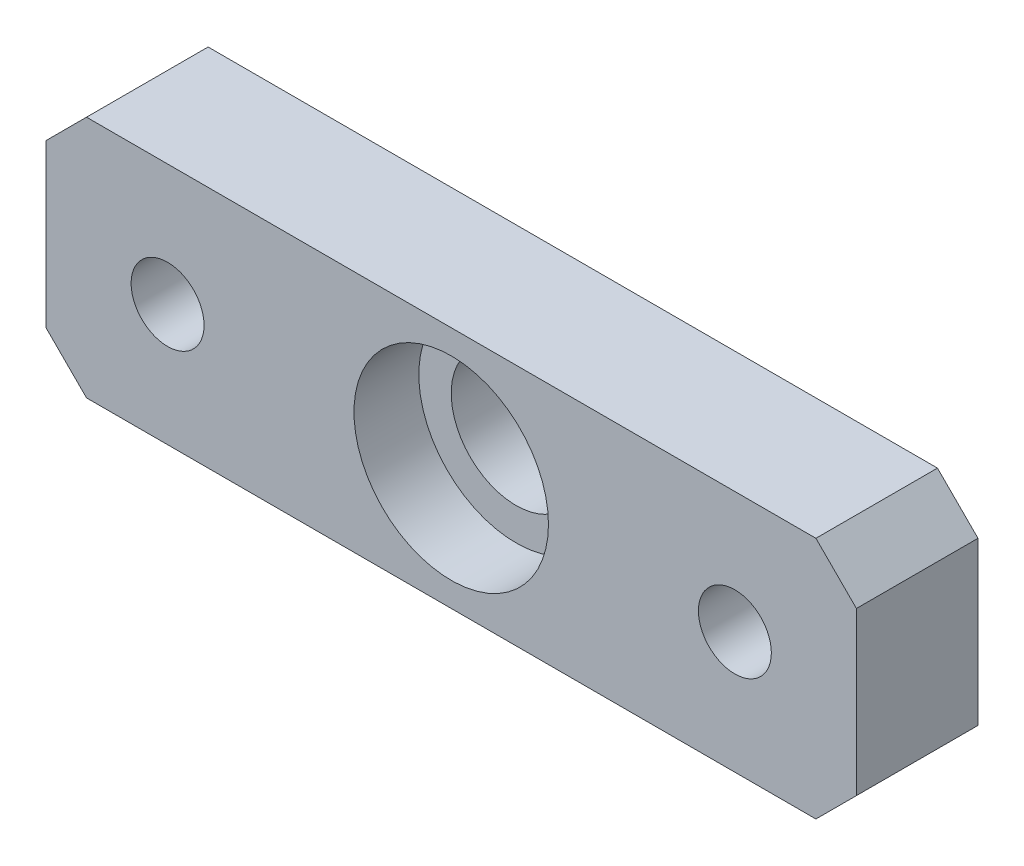
ISO-10303-21;
HEADER;
FILE_DESCRIPTION(('STEP AP214'),'2;1');
FILE_NAME('part.step','',(''),(''),'','','');
FILE_SCHEMA(('AUTOMOTIVE_DESIGN { 1 0 10303 214 1 1 1 1 }'));
ENDSEC;
DATA;
#1=APPLICATION_CONTEXT('core data for automotive mechanical design processes');
#2=APPLICATION_PROTOCOL_DEFINITION('international standard','automotive_design',2000,#1);
#3=PRODUCT_CONTEXT('',#1,'mechanical');
#4=PRODUCT('Part','Part','',(#3));
#5=PRODUCT_RELATED_PRODUCT_CATEGORY('part','',(#4));
#6=PRODUCT_DEFINITION_FORMATION('','',#4);
#7=PRODUCT_DEFINITION_CONTEXT('part definition',#1,'design');
#8=PRODUCT_DEFINITION('design','',#6,#7);
#9=PRODUCT_DEFINITION_SHAPE('','',#8);
#10=(LENGTH_UNIT() NAMED_UNIT(*) SI_UNIT(.MILLI.,.METRE.));
#11=(NAMED_UNIT(*) PLANE_ANGLE_UNIT() SI_UNIT($,.RADIAN.));
#12=(NAMED_UNIT(*) SI_UNIT($,.STERADIAN.) SOLID_ANGLE_UNIT());
#13=UNCERTAINTY_MEASURE_WITH_UNIT(LENGTH_MEASURE(1.E-05),#10,'distance_accuracy_value','');
#14=(GEOMETRIC_REPRESENTATION_CONTEXT(3) GLOBAL_UNCERTAINTY_ASSIGNED_CONTEXT((#13)) GLOBAL_UNIT_ASSIGNED_CONTEXT((#10,
#11,#12)) REPRESENTATION_CONTEXT('',''));
#15=CARTESIAN_POINT('',(0.,0.,0.));
#16=DIRECTION('',(0.,0.,1.));
#17=DIRECTION('',(1.,0.,0.));
#18=AXIS2_PLACEMENT_3D('',#15,#16,#17);
#19=CARTESIAN_POINT('',(15.,15.,15.));
#20=DIRECTION('',(0.,0.,-1.));
#21=DIRECTION('',(-1.,0.,0.));
#22=AXIS2_PLACEMENT_3D('',#19,#20,#21);
#23=CYLINDRICAL_SURFACE('',#22,4.5);
#24=CARTESIAN_POINT('',(15.,15.,15.));
#25=DIRECTION('',(0.,0.,1.));
#26=DIRECTION('',(1.,0.,0.));
#27=AXIS2_PLACEMENT_3D('',#24,#25,#26);
#28=CIRCLE('',#27,4.5);
#29=CARTESIAN_POINT('',(19.5,15.,15.));
#30=VERTEX_POINT('',#29);
#31=EDGE_CURVE('E191',#30,#30,#28,.T.);
#32=ORIENTED_EDGE('',*,*,#31,.T.);
#33=EDGE_LOOP('',(#32));
#34=FACE_BOUND('',#33,.T.);
#35=CARTESIAN_POINT('',(15.,15.,8.));
#36=DIRECTION('',(0.,0.,-1.));
#37=DIRECTION('',(-1.,0.,0.));
#38=AXIS2_PLACEMENT_3D('',#35,#36,#37);
#39=CIRCLE('',#38,4.5);
#40=CARTESIAN_POINT('',(10.5,15.,8.));
#41=VERTEX_POINT('',#40);
#42=EDGE_CURVE('E145',#41,#41,#39,.T.);
#43=ORIENTED_EDGE('',*,*,#42,.T.);
#44=EDGE_LOOP('',(#43));
#45=FACE_BOUND('',#44,.T.);
#46=ADVANCED_FACE('F36',(#34,#45),#23,.F.);
#47=CARTESIAN_POINT('',(85.,15.,15.));
#48=DIRECTION('',(0.,0.,-1.));
#49=DIRECTION('',(-1.,0.,0.));
#50=AXIS2_PLACEMENT_3D('',#47,#48,#49);
#51=CYLINDRICAL_SURFACE('',#50,4.5);
#52=CARTESIAN_POINT('',(85.,15.,15.));
#53=DIRECTION('',(0.,0.,1.));
#54=DIRECTION('',(1.,0.,0.));
#55=AXIS2_PLACEMENT_3D('',#52,#53,#54);
#56=CIRCLE('',#55,4.5);
#57=CARTESIAN_POINT('',(89.5,15.,15.));
#58=VERTEX_POINT('',#57);
#59=EDGE_CURVE('E138',#58,#58,#56,.T.);
#60=ORIENTED_EDGE('',*,*,#59,.T.);
#61=EDGE_LOOP('',(#60));
#62=FACE_BOUND('',#61,.T.);
#63=CARTESIAN_POINT('',(85.,15.,8.));
#64=DIRECTION('',(0.,0.,-1.));
#65=DIRECTION('',(-1.,0.,0.));
#66=AXIS2_PLACEMENT_3D('',#63,#64,#65);
#67=CIRCLE('',#66,4.5);
#68=CARTESIAN_POINT('',(80.5,15.,8.));
#69=VERTEX_POINT('',#68);
#70=EDGE_CURVE('E140',#69,#69,#67,.T.);
#71=ORIENTED_EDGE('',*,*,#70,.T.);
#72=EDGE_LOOP('',(#71));
#73=FACE_BOUND('',#72,.T.);
#74=ADVANCED_FACE('F250',(#62,#73),#51,.F.);
#75=CARTESIAN_POINT('',(50.,15.,15.));
#76=DIRECTION('',(0.,0.,-1.));
#77=DIRECTION('',(-1.,0.,0.));
#78=AXIS2_PLACEMENT_3D('',#75,#76,#77);
#79=CYLINDRICAL_SURFACE('',#78,8.);
#80=CARTESIAN_POINT('',(50.,15.,0.));
#81=DIRECTION('',(0.,0.,1.));
#82=DIRECTION('',(1.,0.,0.));
#83=AXIS2_PLACEMENT_3D('',#80,#81,#82);
#84=CIRCLE('',#83,8.);
#85=CARTESIAN_POINT('',(58.,15.,0.));
#86=VERTEX_POINT('',#85);
#87=EDGE_CURVE('E196',#86,#86,#84,.T.);
#88=ORIENTED_EDGE('',*,*,#87,.F.);
#89=EDGE_LOOP('',(#88));
#90=FACE_BOUND('',#89,.T.);
#91=CARTESIAN_POINT('',(50.,15.,7.));
#92=DIRECTION('',(0.,0.,1.));
#93=DIRECTION('',(1.,0.,0.));
#94=AXIS2_PLACEMENT_3D('',#91,#92,#93);
#95=CIRCLE('',#94,8.);
#96=CARTESIAN_POINT('',(58.,15.,7.));
#97=VERTEX_POINT('',#96);
#98=EDGE_CURVE('E135',#97,#97,#95,.T.);
#99=ORIENTED_EDGE('',*,*,#98,.T.);
#100=EDGE_LOOP('',(#99));
#101=FACE_BOUND('',#100,.T.);
#102=ADVANCED_FACE('F255',(#90,#101),#79,.F.);
#103=CARTESIAN_POINT('',(0.,0.,15.));
#104=DIRECTION('',(0.,0.,-1.));
#105=DIRECTION('',(-1.,0.,0.));
#106=AXIS2_PLACEMENT_3D('',#103,#104,#105);
#107=PLANE('',#106);
#108=CARTESIAN_POINT('',(50.,15.,15.));
#109=DIRECTION('',(0.,0.,1.));
#110=DIRECTION('',(1.,0.,0.));
#111=AXIS2_PLACEMENT_3D('',#108,#109,#110);
#112=CIRCLE('',#111,12.);
#113=CARTESIAN_POINT('',(62.,15.,15.));
#114=VERTEX_POINT('',#113);
#115=EDGE_CURVE('E143',#114,#114,#112,.T.);
#116=ORIENTED_EDGE('',*,*,#115,.F.);
#117=EDGE_LOOP('',(#116));
#118=FACE_BOUND('',#117,.T.);
#119=DIRECTION('',(1.,0.,0.));
#120=VECTOR('',#119,1.);
#121=CARTESIAN_POINT('',(0.,0.,15.));
#122=LINE('',#121,#120);
#123=CARTESIAN_POINT('',(4.99999999999999,0.,15.));
#124=VERTEX_POINT('',#123);
#125=CARTESIAN_POINT('',(95.,0.,15.));
#126=VERTEX_POINT('',#125);
#127=EDGE_CURVE('E186',#124,#126,#122,.T.);
#128=ORIENTED_EDGE('',*,*,#127,.T.);
#129=DIRECTION('',(-0.707106781186549,-0.707106781186547,0.));
#130=VECTOR('',#129,1.);
#131=CARTESIAN_POINT('',(100.,4.99999999999999,15.));
#132=LINE('',#131,#130);
#133=CARTESIAN_POINT('',(100.,4.99999999999999,15.));
#134=VERTEX_POINT('',#133);
#135=EDGE_CURVE('E164',#126,#134,#132,.F.);
#136=ORIENTED_EDGE('',*,*,#135,.T.);
#137=DIRECTION('',(0.,1.,0.));
#138=VECTOR('',#137,1.);
#139=CARTESIAN_POINT('',(100.,0.,15.));
#140=LINE('',#139,#138);
#141=CARTESIAN_POINT('',(100.,25.,15.));
#142=VERTEX_POINT('',#141);
#143=EDGE_CURVE('E120',#134,#142,#140,.T.);
#144=ORIENTED_EDGE('',*,*,#143,.T.);
#145=DIRECTION('',(0.707106781186547,-0.707106781186549,0.));
#146=VECTOR('',#145,1.);
#147=CARTESIAN_POINT('',(95.,30.,15.));
#148=LINE('',#147,#146);
#149=CARTESIAN_POINT('',(95.,30.,15.));
#150=VERTEX_POINT('',#149);
#151=EDGE_CURVE('E56',#142,#150,#148,.F.);
#152=ORIENTED_EDGE('',*,*,#151,.T.);
#153=DIRECTION('',(-1.,0.,0.));
#154=VECTOR('',#153,1.);
#155=CARTESIAN_POINT('',(0.,30.,15.));
#156=LINE('',#155,#154);
#157=CARTESIAN_POINT('',(5.,30.,15.));
#158=VERTEX_POINT('',#157);
#159=EDGE_CURVE('E150',#150,#158,#156,.T.);
#160=ORIENTED_EDGE('',*,*,#159,.T.);
#161=DIRECTION('',(0.707106781186549,0.707106781186547,0.));
#162=VECTOR('',#161,1.);
#163=CARTESIAN_POINT('',(0.,25.,15.));
#164=LINE('',#163,#162);
#165=CARTESIAN_POINT('',(0.,25.,15.));
#166=VERTEX_POINT('',#165);
#167=EDGE_CURVE('E160',#158,#166,#164,.F.);
#168=ORIENTED_EDGE('',*,*,#167,.T.);
#169=DIRECTION('',(0.,-1.,0.));
#170=VECTOR('',#169,1.);
#171=CARTESIAN_POINT('',(0.,0.,15.));
#172=LINE('',#171,#170);
#173=CARTESIAN_POINT('',(0.,5.,15.));
#174=VERTEX_POINT('',#173);
#175=EDGE_CURVE('E129',#166,#174,#172,.T.);
#176=ORIENTED_EDGE('',*,*,#175,.T.);
#177=DIRECTION('',(-0.707106781186547,0.707106781186549,0.));
#178=VECTOR('',#177,1.);
#179=CARTESIAN_POINT('',(4.99999999999999,0.,15.));
#180=LINE('',#179,#178);
#181=EDGE_CURVE('E162',#174,#124,#180,.F.);
#182=ORIENTED_EDGE('',*,*,#181,.T.);
#183=EDGE_LOOP('',(#128,#136,#144,#152,#160,#168,#176,#182));
#184=FACE_BOUND('',#183,.T.);
#185=ORIENTED_EDGE('',*,*,#31,.F.);
#186=EDGE_LOOP('',(#185));
#187=FACE_BOUND('',#186,.T.);
#188=ORIENTED_EDGE('',*,*,#59,.F.);
#189=EDGE_LOOP('',(#188));
#190=FACE_BOUND('',#189,.T.);
#191=ADVANCED_FACE('F230',(#118,#184,#187,#190),#107,.F.);
#192=CARTESIAN_POINT('',(0.,0.,0.));
#193=DIRECTION('',(0.,0.,-1.));
#194=DIRECTION('',(-1.,0.,0.));
#195=AXIS2_PLACEMENT_3D('',#192,#193,#194);
#196=PLANE('',#195);
#197=CARTESIAN_POINT('',(15.,15.,0.));
#198=DIRECTION('',(0.,0.,-1.));
#199=DIRECTION('',(-1.,0.,0.));
#200=AXIS2_PLACEMENT_3D('',#197,#198,#199);
#201=CIRCLE('',#200,6.5);
#202=CARTESIAN_POINT('',(8.5,15.,0.));
#203=VERTEX_POINT('',#202);
#204=EDGE_CURVE('E213',#203,#203,#201,.T.);
#205=ORIENTED_EDGE('',*,*,#204,.F.);
#206=EDGE_LOOP('',(#205));
#207=FACE_BOUND('',#206,.T.);
#208=CARTESIAN_POINT('',(85.,15.,0.));
#209=DIRECTION('',(0.,0.,-1.));
#210=DIRECTION('',(-1.,0.,0.));
#211=AXIS2_PLACEMENT_3D('',#208,#209,#210);
#212=CIRCLE('',#211,6.5);
#213=CARTESIAN_POINT('',(78.5,15.,0.));
#214=VERTEX_POINT('',#213);
#215=EDGE_CURVE('E148',#214,#214,#212,.T.);
#216=ORIENTED_EDGE('',*,*,#215,.F.);
#217=EDGE_LOOP('',(#216));
#218=FACE_BOUND('',#217,.T.);
#219=ORIENTED_EDGE('',*,*,#87,.T.);
#220=EDGE_LOOP('',(#219));
#221=FACE_BOUND('',#220,.T.);
#222=DIRECTION('',(0.,1.,0.));
#223=VECTOR('',#222,1.);
#224=CARTESIAN_POINT('',(100.,0.,0.));
#225=LINE('',#224,#223);
#226=CARTESIAN_POINT('',(100.,5.,0.));
#227=VERTEX_POINT('',#226);
#228=CARTESIAN_POINT('',(100.,25.,0.));
#229=VERTEX_POINT('',#228);
#230=EDGE_CURVE('E118',#227,#229,#225,.T.);
#231=ORIENTED_EDGE('',*,*,#230,.F.);
#232=DIRECTION('',(0.707106781186549,0.707106781186547,0.));
#233=VECTOR('',#232,1.);
#234=CARTESIAN_POINT('',(47.4999999999999,-47.5,0.));
#235=LINE('',#234,#233);
#236=CARTESIAN_POINT('',(95.,0.,0.));
#237=VERTEX_POINT('',#236);
#238=EDGE_CURVE('E101',#227,#237,#235,.F.);
#239=ORIENTED_EDGE('',*,*,#238,.T.);
#240=DIRECTION('',(1.,0.,0.));
#241=VECTOR('',#240,1.);
#242=CARTESIAN_POINT('',(0.,0.,0.));
#243=LINE('',#242,#241);
#244=CARTESIAN_POINT('',(4.99999999999999,0.,0.));
#245=VERTEX_POINT('',#244);
#246=EDGE_CURVE('E127',#245,#237,#243,.T.);
#247=ORIENTED_EDGE('',*,*,#246,.F.);
#248=DIRECTION('',(0.707106781186547,-0.707106781186549,0.));
#249=VECTOR('',#248,1.);
#250=CARTESIAN_POINT('',(2.5,2.5,0.));
#251=LINE('',#250,#249);
#252=CARTESIAN_POINT('',(0.,5.,0.));
#253=VERTEX_POINT('',#252);
#254=EDGE_CURVE('E112',#245,#253,#251,.F.);
#255=ORIENTED_EDGE('',*,*,#254,.T.);
#256=DIRECTION('',(0.,-1.,0.));
#257=VECTOR('',#256,1.);
#258=CARTESIAN_POINT('',(0.,0.,0.));
#259=LINE('',#258,#257);
#260=CARTESIAN_POINT('',(0.,25.,0.));
#261=VERTEX_POINT('',#260);
#262=EDGE_CURVE('E131',#261,#253,#259,.T.);
#263=ORIENTED_EDGE('',*,*,#262,.F.);
#264=DIRECTION('',(-0.707106781186549,-0.707106781186547,0.));
#265=VECTOR('',#264,1.);
#266=CARTESIAN_POINT('',(-12.5,12.5,0.));
#267=LINE('',#266,#265);
#268=CARTESIAN_POINT('',(5.,30.,0.));
#269=VERTEX_POINT('',#268);
#270=EDGE_CURVE('E153',#261,#269,#267,.F.);
#271=ORIENTED_EDGE('',*,*,#270,.T.);
#272=DIRECTION('',(-1.,0.,0.));
#273=VECTOR('',#272,1.);
#274=CARTESIAN_POINT('',(0.,30.,0.));
#275=LINE('',#274,#273);
#276=CARTESIAN_POINT('',(95.,30.,0.));
#277=VERTEX_POINT('',#276);
#278=EDGE_CURVE('E126',#277,#269,#275,.T.);
#279=ORIENTED_EDGE('',*,*,#278,.F.);
#280=DIRECTION('',(-0.707106781186547,0.707106781186549,0.));
#281=VECTOR('',#280,1.);
#282=CARTESIAN_POINT('',(62.5000000000001,62.5,0.));
#283=LINE('',#282,#281);
#284=EDGE_CURVE('E121',#277,#229,#283,.F.);
#285=ORIENTED_EDGE('',*,*,#284,.T.);
#286=EDGE_LOOP('',(#231,#239,#247,#255,#263,#271,#279,#285));
#287=FACE_BOUND('',#286,.T.);
#288=ADVANCED_FACE('F124',(#207,#218,#221,#287),#196,.T.);
#289=CARTESIAN_POINT('',(0.,0.,15.));
#290=DIRECTION('',(1.,0.,0.));
#291=DIRECTION('',(0.,0.,-1.));
#292=AXIS2_PLACEMENT_3D('',#289,#290,#291);
#293=PLANE('',#292);
#294=ORIENTED_EDGE('',*,*,#262,.T.);
#295=DIRECTION('',(0.,0.,1.));
#296=VECTOR('',#295,1.);
#297=CARTESIAN_POINT('',(0.,5.,15.));
#298=LINE('',#297,#296);
#299=EDGE_CURVE('E169',#253,#174,#298,.T.);
#300=ORIENTED_EDGE('',*,*,#299,.T.);
#301=ORIENTED_EDGE('',*,*,#175,.F.);
#302=DIRECTION('',(0.,0.,-1.));
#303=VECTOR('',#302,1.);
#304=CARTESIAN_POINT('',(0.,25.,15.));
#305=LINE('',#304,#303);
#306=EDGE_CURVE('E166',#166,#261,#305,.T.);
#307=ORIENTED_EDGE('',*,*,#306,.T.);
#308=EDGE_LOOP('',(#294,#300,#301,#307));
#309=FACE_BOUND('',#308,.T.);
#310=ADVANCED_FACE('F182',(#309),#293,.F.);
#311=CARTESIAN_POINT('',(0.,0.,15.));
#312=DIRECTION('',(0.,1.,0.));
#313=DIRECTION('',(0.,0.,1.));
#314=AXIS2_PLACEMENT_3D('',#311,#312,#313);
#315=PLANE('',#314);
#316=ORIENTED_EDGE('',*,*,#246,.T.);
#317=DIRECTION('',(0.,0.,1.));
#318=VECTOR('',#317,1.);
#319=CARTESIAN_POINT('',(95.,0.,15.));
#320=LINE('',#319,#318);
#321=EDGE_CURVE('E106',#237,#126,#320,.T.);
#322=ORIENTED_EDGE('',*,*,#321,.T.);
#323=ORIENTED_EDGE('',*,*,#127,.F.);
#324=DIRECTION('',(0.,0.,-1.));
#325=VECTOR('',#324,1.);
#326=CARTESIAN_POINT('',(4.99999999999999,0.,15.));
#327=LINE('',#326,#325);
#328=EDGE_CURVE('E111',#124,#245,#327,.T.);
#329=ORIENTED_EDGE('',*,*,#328,.T.);
#330=EDGE_LOOP('',(#316,#322,#323,#329));
#331=FACE_BOUND('',#330,.T.);
#332=ADVANCED_FACE('F268',(#331),#315,.F.);
#333=CARTESIAN_POINT('',(100.,0.,15.));
#334=DIRECTION('',(-1.,0.,0.));
#335=DIRECTION('',(0.,0.,1.));
#336=AXIS2_PLACEMENT_3D('',#333,#334,#335);
#337=PLANE('',#336);
#338=ORIENTED_EDGE('',*,*,#143,.F.);
#339=DIRECTION('',(0.,0.,-1.));
#340=VECTOR('',#339,1.);
#341=CARTESIAN_POINT('',(100.,4.99999999999999,15.));
#342=LINE('',#341,#340);
#343=EDGE_CURVE('E105',#134,#227,#342,.T.);
#344=ORIENTED_EDGE('',*,*,#343,.T.);
#345=ORIENTED_EDGE('',*,*,#230,.T.);
#346=DIRECTION('',(0.,0.,1.));
#347=VECTOR('',#346,1.);
#348=CARTESIAN_POINT('',(100.,25.,15.));
#349=LINE('',#348,#347);
#350=EDGE_CURVE('E122',#229,#142,#349,.T.);
#351=ORIENTED_EDGE('',*,*,#350,.T.);
#352=EDGE_LOOP('',(#338,#344,#345,#351));
#353=FACE_BOUND('',#352,.T.);
#354=ADVANCED_FACE('F117',(#353),#337,.F.);
#355=CARTESIAN_POINT('',(0.,30.,15.));
#356=DIRECTION('',(0.,-1.,0.));
#357=DIRECTION('',(0.,0.,-1.));
#358=AXIS2_PLACEMENT_3D('',#355,#356,#357);
#359=PLANE('',#358);
#360=ORIENTED_EDGE('',*,*,#278,.T.);
#361=DIRECTION('',(0.,0.,1.));
#362=VECTOR('',#361,1.);
#363=CARTESIAN_POINT('',(5.,30.,15.));
#364=LINE('',#363,#362);
#365=EDGE_CURVE('E11',#269,#158,#364,.T.);
#366=ORIENTED_EDGE('',*,*,#365,.T.);
#367=ORIENTED_EDGE('',*,*,#159,.F.);
#368=DIRECTION('',(0.,0.,-1.));
#369=VECTOR('',#368,1.);
#370=CARTESIAN_POINT('',(95.,30.,15.));
#371=LINE('',#370,#369);
#372=EDGE_CURVE('E44',#150,#277,#371,.T.);
#373=ORIENTED_EDGE('',*,*,#372,.T.);
#374=EDGE_LOOP('',(#360,#366,#367,#373));
#375=FACE_BOUND('',#374,.T.);
#376=ADVANCED_FACE('F172',(#375),#359,.F.);
#377=CARTESIAN_POINT('',(50.,15.,7.));
#378=DIRECTION('',(0.,0.,1.));
#379=DIRECTION('',(1.,0.,0.));
#380=AXIS2_PLACEMENT_3D('',#377,#378,#379);
#381=CYLINDRICAL_SURFACE('',#380,12.);
#382=CARTESIAN_POINT('',(50.,15.,7.));
#383=DIRECTION('',(0.,0.,1.));
#384=DIRECTION('',(1.,0.,0.));
#385=AXIS2_PLACEMENT_3D('',#382,#383,#384);
#386=CIRCLE('',#385,12.);
#387=CARTESIAN_POINT('',(62.,15.,7.));
#388=VERTEX_POINT('',#387);
#389=EDGE_CURVE('E139',#388,#388,#386,.T.);
#390=ORIENTED_EDGE('',*,*,#389,.F.);
#391=EDGE_LOOP('',(#390));
#392=FACE_BOUND('',#391,.T.);
#393=ORIENTED_EDGE('',*,*,#115,.T.);
#394=EDGE_LOOP('',(#393));
#395=FACE_BOUND('',#394,.T.);
#396=ADVANCED_FACE('F245',(#392,#395),#381,.F.);
#397=CARTESIAN_POINT('',(50.,15.,7.));
#398=DIRECTION('',(0.,0.,1.));
#399=DIRECTION('',(1.,0.,0.));
#400=AXIS2_PLACEMENT_3D('',#397,#398,#399);
#401=PLANE('',#400);
#402=ORIENTED_EDGE('',*,*,#98,.F.);
#403=EDGE_LOOP('',(#402));
#404=FACE_BOUND('',#403,.T.);
#405=ORIENTED_EDGE('',*,*,#389,.T.);
#406=EDGE_LOOP('',(#405));
#407=FACE_BOUND('',#406,.T.);
#408=ADVANCED_FACE('F236',(#404,#407),#401,.T.);
#409=CARTESIAN_POINT('',(85.,15.,8.));
#410=DIRECTION('',(0.,0.,-1.));
#411=DIRECTION('',(-1.,0.,0.));
#412=AXIS2_PLACEMENT_3D('',#409,#410,#411);
#413=CYLINDRICAL_SURFACE('',#412,6.5);
#414=CARTESIAN_POINT('',(85.,15.,8.));
#415=DIRECTION('',(0.,0.,-1.));
#416=DIRECTION('',(-1.,0.,0.));
#417=AXIS2_PLACEMENT_3D('',#414,#415,#416);
#418=CIRCLE('',#417,6.5);
#419=CARTESIAN_POINT('',(78.5,15.,8.));
#420=VERTEX_POINT('',#419);
#421=EDGE_CURVE('E144',#420,#420,#418,.T.);
#422=ORIENTED_EDGE('',*,*,#421,.F.);
#423=EDGE_LOOP('',(#422));
#424=FACE_BOUND('',#423,.T.);
#425=ORIENTED_EDGE('',*,*,#215,.T.);
#426=EDGE_LOOP('',(#425));
#427=FACE_BOUND('',#426,.T.);
#428=ADVANCED_FACE('F234',(#424,#427),#413,.F.);
#429=CARTESIAN_POINT('',(85.,15.,8.));
#430=DIRECTION('',(0.,0.,-1.));
#431=DIRECTION('',(-1.,0.,0.));
#432=AXIS2_PLACEMENT_3D('',#429,#430,#431);
#433=PLANE('',#432);
#434=ORIENTED_EDGE('',*,*,#70,.F.);
#435=EDGE_LOOP('',(#434));
#436=FACE_BOUND('',#435,.T.);
#437=ORIENTED_EDGE('',*,*,#421,.T.);
#438=EDGE_LOOP('',(#437));
#439=FACE_BOUND('',#438,.T.);
#440=ADVANCED_FACE('F224',(#436,#439),#433,.T.);
#441=CARTESIAN_POINT('',(15.,15.,8.));
#442=DIRECTION('',(0.,0.,-1.));
#443=DIRECTION('',(-1.,0.,0.));
#444=AXIS2_PLACEMENT_3D('',#441,#442,#443);
#445=CYLINDRICAL_SURFACE('',#444,6.5);
#446=CARTESIAN_POINT('',(15.,15.,8.));
#447=DIRECTION('',(0.,0.,-1.));
#448=DIRECTION('',(-1.,0.,0.));
#449=AXIS2_PLACEMENT_3D('',#446,#447,#448);
#450=CIRCLE('',#449,6.5);
#451=CARTESIAN_POINT('',(8.5,15.,8.));
#452=VERTEX_POINT('',#451);
#453=EDGE_CURVE('E149',#452,#452,#450,.T.);
#454=ORIENTED_EDGE('',*,*,#453,.F.);
#455=EDGE_LOOP('',(#454));
#456=FACE_BOUND('',#455,.T.);
#457=ORIENTED_EDGE('',*,*,#204,.T.);
#458=EDGE_LOOP('',(#457));
#459=FACE_BOUND('',#458,.T.);
#460=ADVANCED_FACE('F221',(#456,#459),#445,.F.);
#461=CARTESIAN_POINT('',(15.,15.,8.));
#462=DIRECTION('',(0.,0.,-1.));
#463=DIRECTION('',(-1.,0.,0.));
#464=AXIS2_PLACEMENT_3D('',#461,#462,#463);
#465=PLANE('',#464);
#466=ORIENTED_EDGE('',*,*,#42,.F.);
#467=EDGE_LOOP('',(#466));
#468=FACE_BOUND('',#467,.T.);
#469=ORIENTED_EDGE('',*,*,#453,.T.);
#470=EDGE_LOOP('',(#469));
#471=FACE_BOUND('',#470,.T.);
#472=ADVANCED_FACE('F219',(#468,#471),#465,.T.);
#473=CARTESIAN_POINT('',(100.,4.99999999999999,15.));
#474=DIRECTION('',(-0.707106781186546,0.707106781186548,0.));
#475=DIRECTION('',(0.,0.,-1.));
#476=AXIS2_PLACEMENT_3D('',#473,#474,#475);
#477=PLANE('',#476);
#478=ORIENTED_EDGE('',*,*,#135,.F.);
#479=ORIENTED_EDGE('',*,*,#321,.F.);
#480=ORIENTED_EDGE('',*,*,#238,.F.);
#481=ORIENTED_EDGE('',*,*,#343,.F.);
#482=EDGE_LOOP('',(#478,#479,#480,#481));
#483=FACE_BOUND('',#482,.T.);
#484=ADVANCED_FACE('F104',(#483),#477,.F.);
#485=CARTESIAN_POINT('',(4.99999999999999,0.,15.));
#486=DIRECTION('',(0.707106781186548,0.707106781186546,0.));
#487=DIRECTION('',(0.,0.,-1.));
#488=AXIS2_PLACEMENT_3D('',#485,#486,#487);
#489=PLANE('',#488);
#490=ORIENTED_EDGE('',*,*,#181,.F.);
#491=ORIENTED_EDGE('',*,*,#299,.F.);
#492=ORIENTED_EDGE('',*,*,#254,.F.);
#493=ORIENTED_EDGE('',*,*,#328,.F.);
#494=EDGE_LOOP('',(#490,#491,#492,#493));
#495=FACE_BOUND('',#494,.T.);
#496=ADVANCED_FACE('F276',(#495),#489,.F.);
#497=CARTESIAN_POINT('',(0.,25.,15.));
#498=DIRECTION('',(0.707106781186546,-0.707106781186548,0.));
#499=DIRECTION('',(0.,0.,-1.));
#500=AXIS2_PLACEMENT_3D('',#497,#498,#499);
#501=PLANE('',#500);
#502=ORIENTED_EDGE('',*,*,#167,.F.);
#503=ORIENTED_EDGE('',*,*,#365,.F.);
#504=ORIENTED_EDGE('',*,*,#270,.F.);
#505=ORIENTED_EDGE('',*,*,#306,.F.);
#506=EDGE_LOOP('',(#502,#503,#504,#505));
#507=FACE_BOUND('',#506,.T.);
#508=ADVANCED_FACE('F179',(#507),#501,.F.);
#509=CARTESIAN_POINT('',(95.,30.,15.));
#510=DIRECTION('',(-0.707106781186548,-0.707106781186546,0.));
#511=DIRECTION('',(0.,0.,-1.));
#512=AXIS2_PLACEMENT_3D('',#509,#510,#511);
#513=PLANE('',#512);
#514=ORIENTED_EDGE('',*,*,#151,.F.);
#515=ORIENTED_EDGE('',*,*,#350,.F.);
#516=ORIENTED_EDGE('',*,*,#284,.F.);
#517=ORIENTED_EDGE('',*,*,#372,.F.);
#518=EDGE_LOOP('',(#514,#515,#516,#517));
#519=FACE_BOUND('',#518,.T.);
#520=ADVANCED_FACE('F38',(#519),#513,.F.);
#521=CLOSED_SHELL('',(#46,#74,#102,#191,#288,#310,#332,#354,#376,#396,#408,#428,#440,#460,#472,
#484,#496,#508,#520));
#522=MANIFOLD_SOLID_BREP('B2',#521);
#523=ADVANCED_BREP_SHAPE_REPRESENTATION('',(#18,#522),#14);
#524=SHAPE_DEFINITION_REPRESENTATION(#9,#523);
ENDSEC;
END-ISO-10303-21;
